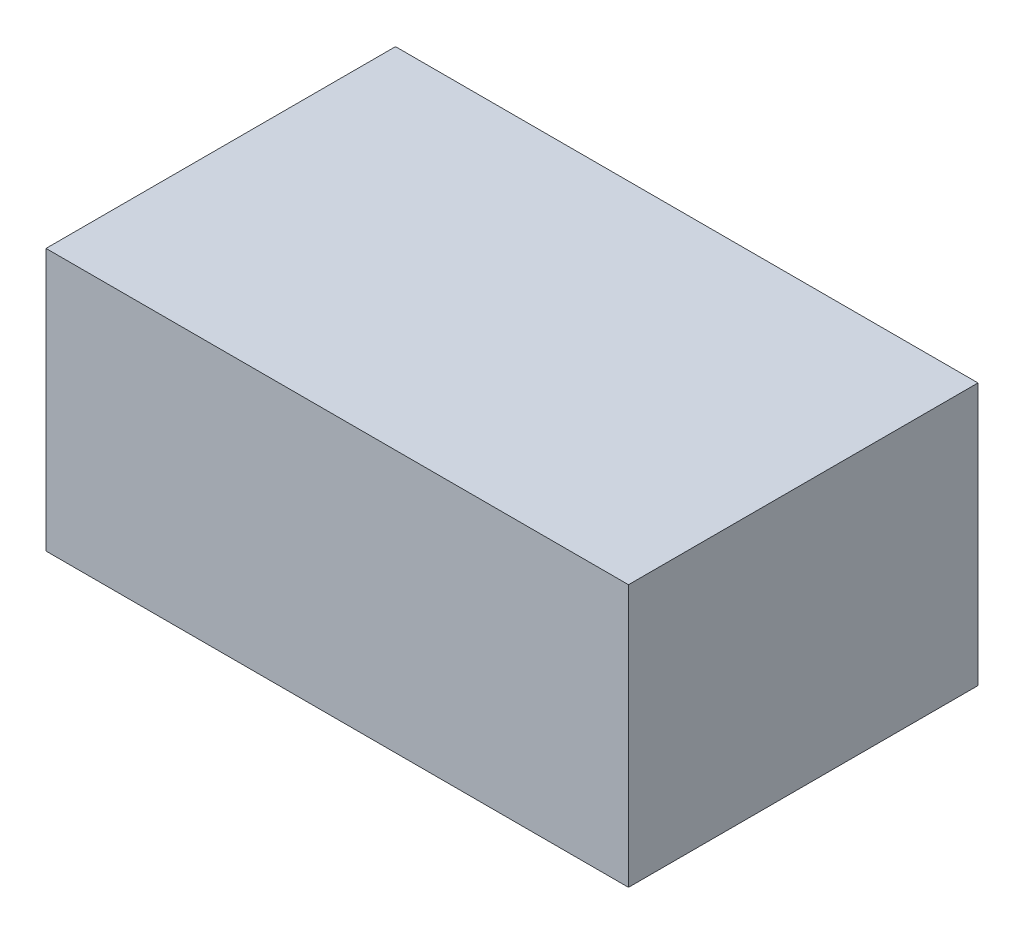
ISO-10303-21;
HEADER;
FILE_DESCRIPTION(('STEP AP214'),'2;1');
FILE_NAME('part.step','',(''),(''),'','','');
FILE_SCHEMA(('AUTOMOTIVE_DESIGN { 1 0 10303 214 1 1 1 1 }'));
ENDSEC;
DATA;
#1=APPLICATION_CONTEXT('core data for automotive mechanical design processes');
#2=APPLICATION_PROTOCOL_DEFINITION('international standard','automotive_design',2000,#1);
#3=PRODUCT_CONTEXT('',#1,'mechanical');
#4=PRODUCT('Part','Part','',(#3));
#5=PRODUCT_RELATED_PRODUCT_CATEGORY('part','',(#4));
#6=PRODUCT_DEFINITION_FORMATION('','',#4);
#7=PRODUCT_DEFINITION_CONTEXT('part definition',#1,'design');
#8=PRODUCT_DEFINITION('design','',#6,#7);
#9=PRODUCT_DEFINITION_SHAPE('','',#8);
#10=(LENGTH_UNIT() NAMED_UNIT(*) SI_UNIT(.MILLI.,.METRE.));
#11=(NAMED_UNIT(*) PLANE_ANGLE_UNIT() SI_UNIT($,.RADIAN.));
#12=(NAMED_UNIT(*) SI_UNIT($,.STERADIAN.) SOLID_ANGLE_UNIT());
#13=UNCERTAINTY_MEASURE_WITH_UNIT(LENGTH_MEASURE(1.E-05),#10,'distance_accuracy_value','');
#14=(GEOMETRIC_REPRESENTATION_CONTEXT(3) GLOBAL_UNCERTAINTY_ASSIGNED_CONTEXT((#13)) GLOBAL_UNIT_ASSIGNED_CONTEXT((#10,
#11,#12)) REPRESENTATION_CONTEXT('',''));
#15=CARTESIAN_POINT('',(0.,0.,0.));
#16=DIRECTION('',(0.,0.,1.));
#17=DIRECTION('',(1.,0.,0.));
#18=AXIS2_PLACEMENT_3D('',#15,#16,#17);
#19=CARTESIAN_POINT('',(-178.586306201408,180.,-127.613293051359));
#20=DIRECTION('',(1.,0.,0.));
#21=DIRECTION('',(0.,0.,-1.));
#22=AXIS2_PLACEMENT_3D('',#19,#20,#21);
#23=PLANE('',#22);
#24=DIRECTION('',(0.,0.,1.));
#25=VECTOR('',#24,1.);
#26=CARTESIAN_POINT('',(-178.586306201408,0.,-127.613293051359));
#27=LINE('',#26,#25);
#28=CARTESIAN_POINT('',(-178.586306201408,0.,-127.613293051359));
#29=VERTEX_POINT('',#28);
#30=CARTESIAN_POINT('',(-178.586306201408,0.,112.386706948641));
#31=VERTEX_POINT('',#30);
#32=EDGE_CURVE('E113',#29,#31,#27,.T.);
#33=ORIENTED_EDGE('',*,*,#32,.T.);
#34=DIRECTION('',(0.,-1.,0.));
#35=VECTOR('',#34,1.);
#36=CARTESIAN_POINT('',(-178.586306201408,180.,112.386706948641));
#37=LINE('',#36,#35);
#38=CARTESIAN_POINT('',(-178.586306201408,180.,112.386706948641));
#39=VERTEX_POINT('',#38);
#40=EDGE_CURVE('E11',#39,#31,#37,.T.);
#41=ORIENTED_EDGE('',*,*,#40,.F.);
#42=DIRECTION('',(0.,0.,1.));
#43=VECTOR('',#42,1.);
#44=CARTESIAN_POINT('',(-178.586306201408,180.,-127.613293051359));
#45=LINE('',#44,#43);
#46=CARTESIAN_POINT('',(-178.586306201408,180.,-127.613293051359));
#47=VERTEX_POINT('',#46);
#48=EDGE_CURVE('E97',#47,#39,#45,.T.);
#49=ORIENTED_EDGE('',*,*,#48,.F.);
#50=DIRECTION('',(0.,-1.,0.));
#51=VECTOR('',#50,1.);
#52=CARTESIAN_POINT('',(-178.586306201408,180.,-127.613293051359));
#53=LINE('',#52,#51);
#54=EDGE_CURVE('E109',#47,#29,#53,.T.);
#55=ORIENTED_EDGE('',*,*,#54,.T.);
#56=EDGE_LOOP('',(#33,#41,#49,#55));
#57=FACE_BOUND('',#56,.T.);
#58=ADVANCED_FACE('F45',(#57),#23,.F.);
#59=CARTESIAN_POINT('',(-178.586306201408,180.,112.386706948641));
#60=DIRECTION('',(0.,0.,-1.));
#61=DIRECTION('',(-1.,0.,0.));
#62=AXIS2_PLACEMENT_3D('',#59,#60,#61);
#63=PLANE('',#62);
#64=DIRECTION('',(1.,0.,0.));
#65=VECTOR('',#64,1.);
#66=CARTESIAN_POINT('',(-178.586306201408,0.,112.386706948641));
#67=LINE('',#66,#65);
#68=CARTESIAN_POINT('',(221.413693798592,0.,112.386706948641));
#69=VERTEX_POINT('',#68);
#70=EDGE_CURVE('E102',#31,#69,#67,.T.);
#71=ORIENTED_EDGE('',*,*,#70,.T.);
#72=DIRECTION('',(0.,-1.,0.));
#73=VECTOR('',#72,1.);
#74=CARTESIAN_POINT('',(221.413693798592,180.,112.386706948641));
#75=LINE('',#74,#73);
#76=CARTESIAN_POINT('',(221.413693798592,180.,112.386706948641));
#77=VERTEX_POINT('',#76);
#78=EDGE_CURVE('E54',#77,#69,#75,.T.);
#79=ORIENTED_EDGE('',*,*,#78,.F.);
#80=DIRECTION('',(1.,0.,0.));
#81=VECTOR('',#80,1.);
#82=CARTESIAN_POINT('',(-178.586306201408,180.,112.386706948641));
#83=LINE('',#82,#81);
#84=EDGE_CURVE('E92',#39,#77,#83,.T.);
#85=ORIENTED_EDGE('',*,*,#84,.F.);
#86=ORIENTED_EDGE('',*,*,#40,.T.);
#87=EDGE_LOOP('',(#71,#79,#85,#86));
#88=FACE_BOUND('',#87,.T.);
#89=ADVANCED_FACE('F101',(#88),#63,.F.);
#90=CARTESIAN_POINT('',(221.413693798592,180.,-127.613293051359));
#91=DIRECTION('',(-1.,0.,0.));
#92=DIRECTION('',(0.,0.,1.));
#93=AXIS2_PLACEMENT_3D('',#90,#91,#92);
#94=PLANE('',#93);
#95=DIRECTION('',(0.,0.,-1.));
#96=VECTOR('',#95,1.);
#97=CARTESIAN_POINT('',(221.413693798592,0.,-127.613293051359));
#98=LINE('',#97,#96);
#99=CARTESIAN_POINT('',(221.413693798592,0.,-127.613293051359));
#100=VERTEX_POINT('',#99);
#101=EDGE_CURVE('E79',#69,#100,#98,.T.);
#102=ORIENTED_EDGE('',*,*,#101,.T.);
#103=DIRECTION('',(0.,-1.,0.));
#104=VECTOR('',#103,1.);
#105=CARTESIAN_POINT('',(221.413693798592,180.,-127.613293051359));
#106=LINE('',#105,#104);
#107=CARTESIAN_POINT('',(221.413693798592,180.,-127.613293051359));
#108=VERTEX_POINT('',#107);
#109=EDGE_CURVE('E104',#108,#100,#106,.T.);
#110=ORIENTED_EDGE('',*,*,#109,.F.);
#111=DIRECTION('',(0.,0.,-1.));
#112=VECTOR('',#111,1.);
#113=CARTESIAN_POINT('',(221.413693798592,180.,-127.613293051359));
#114=LINE('',#113,#112);
#115=EDGE_CURVE('E95',#77,#108,#114,.T.);
#116=ORIENTED_EDGE('',*,*,#115,.F.);
#117=ORIENTED_EDGE('',*,*,#78,.T.);
#118=EDGE_LOOP('',(#102,#110,#116,#117));
#119=FACE_BOUND('',#118,.T.);
#120=ADVANCED_FACE('F105',(#119),#94,.F.);
#121=CARTESIAN_POINT('',(-178.586306201408,180.,-127.613293051359));
#122=DIRECTION('',(0.,0.,1.));
#123=DIRECTION('',(1.,0.,0.));
#124=AXIS2_PLACEMENT_3D('',#121,#122,#123);
#125=PLANE('',#124);
#126=DIRECTION('',(-1.,0.,0.));
#127=VECTOR('',#126,1.);
#128=CARTESIAN_POINT('',(-178.586306201408,0.,-127.613293051359));
#129=LINE('',#128,#127);
#130=EDGE_CURVE('E85',#100,#29,#129,.T.);
#131=ORIENTED_EDGE('',*,*,#130,.T.);
#132=ORIENTED_EDGE('',*,*,#54,.F.);
#133=DIRECTION('',(-1.,0.,0.));
#134=VECTOR('',#133,1.);
#135=CARTESIAN_POINT('',(-178.586306201408,180.,-127.613293051359));
#136=LINE('',#135,#134);
#137=EDGE_CURVE('E62',#108,#47,#136,.T.);
#138=ORIENTED_EDGE('',*,*,#137,.F.);
#139=ORIENTED_EDGE('',*,*,#109,.T.);
#140=EDGE_LOOP('',(#131,#132,#138,#139));
#141=FACE_BOUND('',#140,.T.);
#142=ADVANCED_FACE('F126',(#141),#125,.F.);
#143=CARTESIAN_POINT('',(0.,180.,0.));
#144=DIRECTION('',(0.,1.,0.));
#145=DIRECTION('',(0.,0.,1.));
#146=AXIS2_PLACEMENT_3D('',#143,#144,#145);
#147=PLANE('',#146);
#148=ORIENTED_EDGE('',*,*,#48,.T.);
#149=ORIENTED_EDGE('',*,*,#84,.T.);
#150=ORIENTED_EDGE('',*,*,#115,.T.);
#151=ORIENTED_EDGE('',*,*,#137,.T.);
#152=EDGE_LOOP('',(#148,#149,#150,#151));
#153=FACE_BOUND('',#152,.T.);
#154=ADVANCED_FACE('F93',(#153),#147,.T.);
#155=CARTESIAN_POINT('',(0.,0.,0.));
#156=DIRECTION('',(0.,1.,0.));
#157=DIRECTION('',(0.,0.,1.));
#158=AXIS2_PLACEMENT_3D('',#155,#156,#157);
#159=PLANE('',#158);
#160=ORIENTED_EDGE('',*,*,#32,.F.);
#161=ORIENTED_EDGE('',*,*,#130,.F.);
#162=ORIENTED_EDGE('',*,*,#101,.F.);
#163=ORIENTED_EDGE('',*,*,#70,.F.);
#164=EDGE_LOOP('',(#160,#161,#162,#163));
#165=FACE_BOUND('',#164,.T.);
#166=ADVANCED_FACE('F129',(#165),#159,.F.);
#167=CLOSED_SHELL('',(#58,#89,#120,#142,#154,#166));
#168=MANIFOLD_SOLID_BREP('B2',#167);
#169=ADVANCED_BREP_SHAPE_REPRESENTATION('',(#18,#168),#14);
#170=SHAPE_DEFINITION_REPRESENTATION(#9,#169);
ENDSEC;
END-ISO-10303-21;
